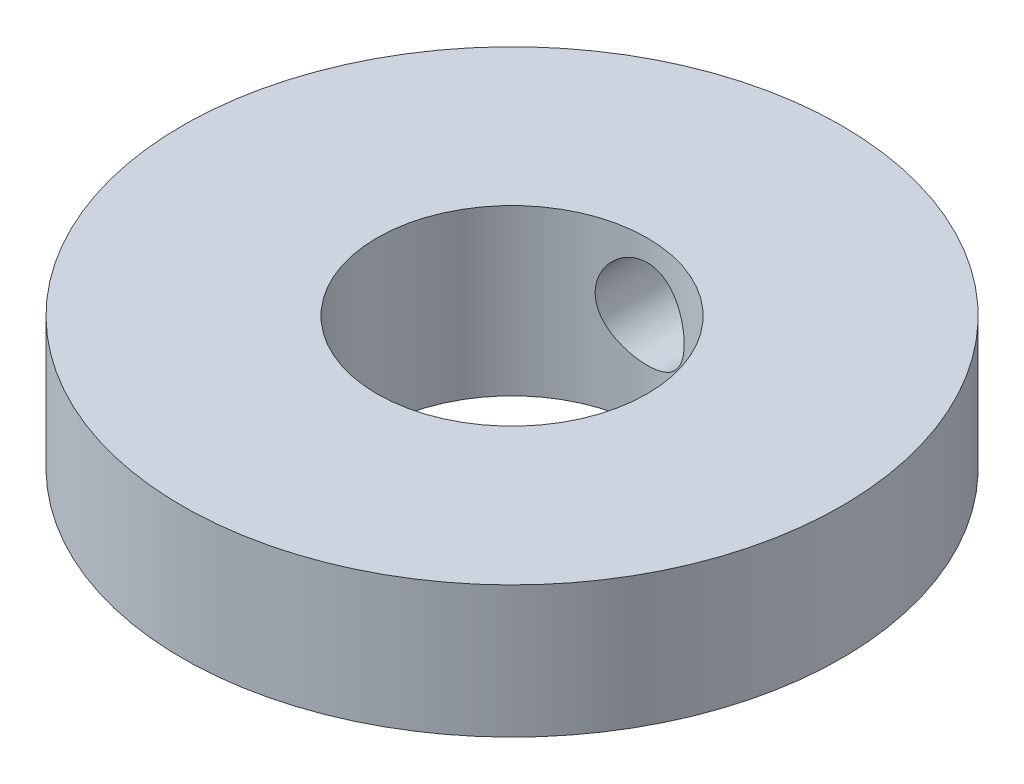
ISO-10303-21;
HEADER;
FILE_DESCRIPTION(('STEP AP214'),'2;1');
FILE_NAME('part.step','',(''),(''),'','','');
FILE_SCHEMA(('AUTOMOTIVE_DESIGN { 1 0 10303 214 1 1 1 1 }'));
ENDSEC;
DATA;
#1=APPLICATION_CONTEXT('core data for automotive mechanical design processes');
#2=APPLICATION_PROTOCOL_DEFINITION('international standard','automotive_design',2000,#1);
#3=PRODUCT_CONTEXT('',#1,'mechanical');
#4=PRODUCT('Part','Part','',(#3));
#5=PRODUCT_RELATED_PRODUCT_CATEGORY('part','',(#4));
#6=PRODUCT_DEFINITION_FORMATION('','',#4);
#7=PRODUCT_DEFINITION_CONTEXT('part definition',#1,'design');
#8=PRODUCT_DEFINITION('design','',#6,#7);
#9=PRODUCT_DEFINITION_SHAPE('','',#8);
#10=(LENGTH_UNIT() NAMED_UNIT(*) SI_UNIT(.MILLI.,.METRE.));
#11=(NAMED_UNIT(*) PLANE_ANGLE_UNIT() SI_UNIT($,.RADIAN.));
#12=(NAMED_UNIT(*) SI_UNIT($,.STERADIAN.) SOLID_ANGLE_UNIT());
#13=UNCERTAINTY_MEASURE_WITH_UNIT(LENGTH_MEASURE(1.E-05),#10,'distance_accuracy_value','');
#14=(GEOMETRIC_REPRESENTATION_CONTEXT(3) GLOBAL_UNCERTAINTY_ASSIGNED_CONTEXT((#13)) GLOBAL_UNIT_ASSIGNED_CONTEXT((#10,
#11,#12)) REPRESENTATION_CONTEXT('',''));
#15=CARTESIAN_POINT('',(0.,0.,0.));
#16=DIRECTION('',(0.,0.,1.));
#17=DIRECTION('',(1.,0.,0.));
#18=AXIS2_PLACEMENT_3D('',#15,#16,#17);
#19=CARTESIAN_POINT('',(0.,0.999999999999997,0.));
#20=DIRECTION('',(0.,1.,0.));
#21=DIRECTION('',(0.,0.,1.));
#22=AXIS2_PLACEMENT_3D('',#19,#20,#21);
#23=CONICAL_SURFACE('',#22,6.00000000000001,0.785398163397454);
#24=CARTESIAN_POINT('',(0.,0.,0.));
#25=DIRECTION('',(0.,-1.,0.));
#26=DIRECTION('',(0.,0.,-1.));
#27=AXIS2_PLACEMENT_3D('',#24,#25,#26);
#28=CIRCLE('',#27,5.);
#29=CARTESIAN_POINT('',(0.,0.,-5.));
#30=VERTEX_POINT('',#29);
#31=EDGE_CURVE('E10',#30,#30,#28,.T.);
#32=ORIENTED_EDGE('',*,*,#31,.F.);
#33=EDGE_LOOP('',(#32));
#34=FACE_BOUND('',#33,.T.);
#35=CARTESIAN_POINT('',(0.,0.999999999999997,0.));
#36=DIRECTION('',(0.,-1.,0.));
#37=DIRECTION('',(0.,0.,-1.));
#38=AXIS2_PLACEMENT_3D('',#35,#36,#37);
#39=CIRCLE('',#38,6.00000000000001);
#40=CARTESIAN_POINT('',(0.,0.999999999999997,-6.00000000000001));
#41=VERTEX_POINT('',#40);
#42=EDGE_CURVE('E56',#41,#41,#39,.T.);
#43=ORIENTED_EDGE('',*,*,#42,.T.);
#44=EDGE_LOOP('',(#43));
#45=FACE_BOUND('',#44,.T.);
#46=ADVANCED_FACE('F40',(#34,#45),#23,.T.);
#47=CARTESIAN_POINT('',(0.,0.,4.1));
#48=DIRECTION('',(0.,1.,0.));
#49=DIRECTION('',(0.,0.,1.));
#50=AXIS2_PLACEMENT_3D('',#47,#48,#49);
#51=PLANE('',#50);
#52=CARTESIAN_POINT('',(0.,0.,0.));
#53=DIRECTION('',(0.,-1.,0.));
#54=DIRECTION('',(0.,0.,-1.));
#55=AXIS2_PLACEMENT_3D('',#52,#53,#54);
#56=CIRCLE('',#55,4.1);
#57=CARTESIAN_POINT('',(0.,0.,-4.1));
#58=VERTEX_POINT('',#57);
#59=EDGE_CURVE('E43',#58,#58,#56,.T.);
#60=ORIENTED_EDGE('',*,*,#59,.F.);
#61=EDGE_LOOP('',(#60));
#62=FACE_BOUND('',#61,.T.);
#63=ORIENTED_EDGE('',*,*,#31,.T.);
#64=EDGE_LOOP('',(#63));
#65=FACE_BOUND('',#64,.T.);
#66=ADVANCED_FACE('F98',(#62,#65),#51,.F.);
#67=CARTESIAN_POINT('',(0.,0.,0.));
#68=DIRECTION('',(0.,-1.,0.));
#69=DIRECTION('',(0.,0.,-1.));
#70=AXIS2_PLACEMENT_3D('',#67,#68,#69);
#71=CYLINDRICAL_SURFACE('',#70,4.1);
#72=CARTESIAN_POINT('',(0.,4.35,-4.1));
#73=CARTESIAN_POINT('',(0.0737111630562041,4.35000016743494,-4.1000000806559));
#74=CARTESIAN_POINT('',(0.147421689789712,4.34394326858112,-4.09799377794591));
#75=CARTESIAN_POINT('',(0.292674687394408,4.31994771628066,-4.09018765508382));
#76=CARTESIAN_POINT('',(0.364216879700478,4.30200754290364,-4.08438734966094));
#77=CARTESIAN_POINT('',(0.503018076222002,4.25492490429227,-4.06962414947325));
#78=CARTESIAN_POINT('',(0.570283924158112,4.22580089164781,-4.06066646616013));
#79=CARTESIAN_POINT('',(0.698976522874712,4.15725972837715,-4.0405049256985));
#80=CARTESIAN_POINT('',(0.760402163106731,4.11784062539983,-4.02930064260065));
#81=CARTESIAN_POINT('',(0.877752566517194,4.02842450428151,-4.00540237206026));
#82=CARTESIAN_POINT('',(0.933451965224357,3.97814113492791,-3.9926733325298));
#83=CARTESIAN_POINT('',(1.03579874043779,3.86903283060785,-3.96735503806707));
#84=CARTESIAN_POINT('',(1.08244418761992,3.81020607977427,-3.9547658134659));
#85=CARTESIAN_POINT('',(1.16663245289822,3.68366758093371,-3.93076879244806));
#86=CARTESIAN_POINT('',(1.20388460109373,3.61575354279026,-3.91940382139912));
#87=CARTESIAN_POINT('',(1.2663428295984,3.47418977835968,-3.89967390201978));
#88=CARTESIAN_POINT('',(1.29155248436287,3.40054176159096,-3.89130806367042));
#89=CARTESIAN_POINT('',(1.32836881593469,3.25215954898706,-3.87889222638682));
#90=CARTESIAN_POINT('',(1.34039695226253,3.17754140700485,-3.87470891055934));
#91=CARTESIAN_POINT('',(1.35182619025594,3.02723787191663,-3.87073714172203));
#92=CARTESIAN_POINT('',(1.3512310823163,2.95155280599829,-3.87094736945798));
#93=CARTESIAN_POINT('',(1.33775843878737,2.80483636174256,-3.87562193416032));
#94=CARTESIAN_POINT('',(1.32542802015055,2.73374766358651,-3.87989676502709));
#95=CARTESIAN_POINT('',(1.28972621282626,2.59471057438907,-3.8919092251993));
#96=CARTESIAN_POINT('',(1.26635353215823,2.5267625518385,-3.89964725970525));
#97=CARTESIAN_POINT('',(1.20886694892202,2.39468058987967,-3.91785129349519));
#98=CARTESIAN_POINT('',(1.17458901815267,2.33062396592721,-3.92835850055104));
#99=CARTESIAN_POINT('',(1.09637883362628,2.20899765230501,-3.95089939690232));
#100=CARTESIAN_POINT('',(1.05244384591102,2.15142980663495,-3.96293351806563));
#101=CARTESIAN_POINT('',(0.953527640808479,2.04133702694316,-3.98792079124611));
#102=CARTESIAN_POINT('',(0.89809825118202,1.98921750396182,-4.00088955560005));
#103=CARTESIAN_POINT('',(0.779125839733224,1.8949093077556,-4.02574855435128));
#104=CARTESIAN_POINT('',(0.715582077868852,1.8527215413199,-4.03763869020675));
#105=CARTESIAN_POINT('',(0.581340580863989,1.77915851054339,-4.05915029711047));
#106=CARTESIAN_POINT('',(0.510580768202032,1.74788947878619,-4.06874920582552));
#107=CARTESIAN_POINT('',(0.364414117052925,1.69782315404957,-4.08443323778912));
#108=CARTESIAN_POINT('',(0.289008861478788,1.67902163823064,-4.09051955068909));
#109=CARTESIAN_POINT('',(0.139125718605279,1.65513675043563,-4.09829667697753));
#110=CARTESIAN_POINT('',(0.064744147068853,1.64950536209984,-4.10016297146787));
#111=CARTESIAN_POINT('',(-0.0839144570552006,1.65056269433756,-4.09981461997456));
#112=CARTESIAN_POINT('',(-0.158191504802405,1.65724939214245,-4.09760064401729));
#113=CARTESIAN_POINT('',(-0.302355148665888,1.68231812976469,-4.08945625416194));
#114=CARTESIAN_POINT('',(-0.372306473620005,1.7003658524118,-4.08363214704165));
#115=CARTESIAN_POINT('',(-0.508161972733057,1.7472283578482,-4.06896101812048));
#116=CARTESIAN_POINT('',(-0.574065632136157,1.7760445068084,-4.06011361277137));
#117=CARTESIAN_POINT('',(-0.701860168063316,1.84445620951587,-4.04001084797669));
#118=CARTESIAN_POINT('',(-0.763602569042601,1.88431203915992,-4.0286989693893));
#119=CARTESIAN_POINT('',(-0.879702345338805,1.97336469853043,-4.00495206623292));
#120=CARTESIAN_POINT('',(-0.934057505801985,2.02256431917328,-3.9925167066724));
#121=CARTESIAN_POINT('',(-1.03634314156696,2.13148562046853,-3.967227435213));
#122=CARTESIAN_POINT('',(-1.08388261454486,2.19157671957381,-3.95437936853783));
#123=CARTESIAN_POINT('',(-1.16824867062623,2.31916014909289,-3.93028325422109));
#124=CARTESIAN_POINT('',(-1.20507522312565,2.38665250064941,-3.91903521115042));
#125=CARTESIAN_POINT('',(-1.26678599134302,2.52711447444346,-3.89952617255393));
#126=CARTESIAN_POINT('',(-1.29169935591977,2.60007021733449,-3.89125789856264));
#127=CARTESIAN_POINT('',(-1.32877939682772,2.74947524062709,-3.87875439870743));
#128=CARTESIAN_POINT('',(-1.34095163247806,2.82592298216094,-3.87451741395018));
#129=CARTESIAN_POINT('',(-1.3517769383077,2.9760174366298,-3.87075295729396));
#130=CARTESIAN_POINT('',(-1.35107744463095,3.04961232825154,-3.87099993733485));
#131=CARTESIAN_POINT('',(-1.33776647482694,3.19557816274012,-3.87561986596802));
#132=CARTESIAN_POINT('',(-1.32515567533759,3.26794917489341,-3.87999258019236));
#133=CARTESIAN_POINT('',(-1.28883356824607,3.40811433242203,-3.89220534438605));
#134=CARTESIAN_POINT('',(-1.26532703319376,3.47596756248779,-3.89998129026874));
#135=CARTESIAN_POINT('',(-1.20804560553727,3.60681948544705,-3.91810209323379));
#136=CARTESIAN_POINT('',(-1.17426846927378,3.66981711383935,-3.92844751153849));
#137=CARTESIAN_POINT('',(-1.09571872469852,3.79208828251116,-3.95109312600493));
#138=CARTESIAN_POINT('',(-1.05053774557258,3.85108743623715,-3.96345798785758));
#139=CARTESIAN_POINT('',(-0.951158804063214,3.96087584276375,-3.98847328203764));
#140=CARTESIAN_POINT('',(-0.89695832052929,4.01166279222396,-4.00112379335344));
#141=CARTESIAN_POINT('',(-0.778625685054189,4.10551123714932,-4.02585713200477));
#142=CARTESIAN_POINT('',(-0.714196276469474,4.1482095621681,-4.03790061212615));
#143=CARTESIAN_POINT('',(-0.578681711796834,4.22212090208891,-4.05953518658945));
#144=CARTESIAN_POINT('',(-0.50759845212688,4.25333717706896,-4.06912697679897));
#145=CARTESIAN_POINT('',(-0.364649265000013,4.30189286666039,-4.08435075447741));
#146=CARTESIAN_POINT('',(-0.293021680152443,4.31987648198325,-4.09016466927805));
#147=CARTESIAN_POINT('',(-0.147595470965586,4.34392841473737,-4.09798875682538));
#148=CARTESIAN_POINT('',(-0.0737974165764129,4.34999983236913,-4.09999991924972));
#149=CARTESIAN_POINT('',(0.,4.35,-4.1));
#150=B_SPLINE_CURVE_WITH_KNOTS('',3,(#72,#73,#74,#75,#76,#77,#78,#79,#80,#81,#82,#83,#84,#85,
#86,#87,#88,#89,#90,#91,#92,#93,#94,#95,#96,#97,#98,#99,#100,#101,#102,#103,#104,#105,#106,#107,
#108,#109,#110,#111,#112,#113,#114,#115,#116,#117,#118,#119,#120,#121,#122,#123,#124,#125,#126,
#127,#128,#129,#130,#131,#132,#133,#134,#135,#136,#137,#138,#139,#140,#141,#142,#143,#144,#145,
#146,#147,#148,#149),.UNSPECIFIED.,.T.,.F.,(4,2,2,2,2,2,2,2,2,2,2,2,2,2,2,2,2,2,2,2,2,2,2,2,2,2,
2,2,2,2,2,2,2,2,2,2,2,2,4),(0.,0.220861982205062,0.441752219220953,0.662279557197952,
0.882848746173892,1.11015594188099,1.33751152187185,1.57121803763517,1.80485514141413,
2.03078193580496,2.25664089188068,2.47246065121859,2.68830566842612,2.90756430947025,
3.12688510379957,3.35736086620194,3.58785766334677,3.82053835200392,4.05314018968711,
4.27587649246112,4.49857622268353,4.71501074468831,4.93147273467955,5.1535508689878,
5.37569544090047,5.607675429976,5.83965608175226,6.07106618795475,6.30237528116303,
6.52208303010694,6.74177829900433,6.95750236971497,7.17327360022313,7.39827022749897,
7.62332985226365,7.85686911826721,8.09034202460456,8.31152001982588,8.53264044488621),.UNSPECIFIED.);
#151=CARTESIAN_POINT('',(0.,4.35,-4.1));
#152=VERTEX_POINT('',#151);
#153=EDGE_CURVE('E68',#152,#152,#150,.T.);
#154=ORIENTED_EDGE('',*,*,#153,.T.);
#155=EDGE_LOOP('',(#154));
#156=FACE_BOUND('',#155,.T.);
#157=CARTESIAN_POINT('',(0.,5.,0.));
#158=DIRECTION('',(0.,-1.,0.));
#159=DIRECTION('',(0.,0.,-1.));
#160=AXIS2_PLACEMENT_3D('',#157,#158,#159);
#161=CIRCLE('',#160,4.1);
#162=CARTESIAN_POINT('',(0.,5.,-4.1));
#163=VERTEX_POINT('',#162);
#164=EDGE_CURVE('E50',#163,#163,#161,.T.);
#165=ORIENTED_EDGE('',*,*,#164,.F.);
#166=EDGE_LOOP('',(#165));
#167=FACE_BOUND('',#166,.T.);
#168=ORIENTED_EDGE('',*,*,#59,.T.);
#169=EDGE_LOOP('',(#168));
#170=FACE_BOUND('',#169,.T.);
#171=ADVANCED_FACE('F103',(#156,#167,#170),#71,.F.);
#172=CARTESIAN_POINT('',(0.,5.,10.));
#173=DIRECTION('',(0.,-1.,0.));
#174=DIRECTION('',(0.,0.,-1.));
#175=AXIS2_PLACEMENT_3D('',#172,#173,#174);
#176=PLANE('',#175);
#177=CARTESIAN_POINT('',(0.,5.,0.));
#178=DIRECTION('',(0.,-1.,0.));
#179=DIRECTION('',(0.,0.,-1.));
#180=AXIS2_PLACEMENT_3D('',#177,#178,#179);
#181=CIRCLE('',#180,10.);
#182=CARTESIAN_POINT('',(0.,5.,-10.));
#183=VERTEX_POINT('',#182);
#184=EDGE_CURVE('E51',#183,#183,#181,.T.);
#185=ORIENTED_EDGE('',*,*,#184,.F.);
#186=EDGE_LOOP('',(#185));
#187=FACE_BOUND('',#186,.T.);
#188=ORIENTED_EDGE('',*,*,#164,.T.);
#189=EDGE_LOOP('',(#188));
#190=FACE_BOUND('',#189,.T.);
#191=ADVANCED_FACE('F91',(#187,#190),#176,.F.);
#192=CARTESIAN_POINT('',(0.,0.,0.));
#193=DIRECTION('',(0.,-1.,0.));
#194=DIRECTION('',(0.,0.,-1.));
#195=AXIS2_PLACEMENT_3D('',#192,#193,#194);
#196=CYLINDRICAL_SURFACE('',#195,10.);
#197=CARTESIAN_POINT('',(0.,4.35,-10.));
#198=CARTESIAN_POINT('',(-0.0754619928033733,4.34999682722801,-9.99999888063832));
#199=CARTESIAN_POINT('',(-0.150969869142969,4.34365141957742,-9.99913682811448));
#200=CARTESIAN_POINT('',(-0.29988092356667,4.31844053604537,-9.99578086597856));
#201=CARTESIAN_POINT('',(-0.373281880743254,4.29956232090011,-9.99328529597587));
#202=CARTESIAN_POINT('',(-0.515802030248598,4.2498552213408,-9.98694317619014));
#203=CARTESIAN_POINT('',(-0.584924199822182,4.21903475743612,-9.98309757849418));
#204=CARTESIAN_POINT('',(-0.717003214570631,4.14633730788185,-9.9744820594727));
#205=CARTESIAN_POINT('',(-0.779961038453511,4.10446208130267,-9.96971228523732));
#206=CARTESIAN_POINT('',(-0.898338108312008,4.01055852245592,-9.95974611568941));
#207=CARTESIAN_POINT('',(-0.95371233315915,3.95847367129148,-9.95454744334816));
#208=CARTESIAN_POINT('',(-1.05496231993912,3.84575085410387,-9.9443275535923));
#209=CARTESIAN_POINT('',(-1.10083757514474,3.7851124320762,-9.93930634565644));
#210=CARTESIAN_POINT('',(-1.18195809747663,3.65670725245793,-9.92998765268688));
#211=CARTESIAN_POINT('',(-1.21716063931035,3.58891327130734,-9.92569310616535));
#212=CARTESIAN_POINT('',(-1.27566354643984,3.44830781360978,-9.91834447659887));
#213=CARTESIAN_POINT('',(-1.29896443705713,3.37549655867897,-9.9152903388053));
#214=CARTESIAN_POINT('',(-1.33286460358717,3.22739324580081,-9.9107903599778));
#215=CARTESIAN_POINT('',(-1.34354033567971,3.15211898757034,-9.90933484179661));
#216=CARTESIAN_POINT('',(-1.3521238264948,3.00083435438565,-9.90816739077428));
#217=CARTESIAN_POINT('',(-1.35003218142711,2.92482401397045,-9.90845537651516));
#218=CARTESIAN_POINT('',(-1.33320294565254,2.77476043741509,-9.91073353943524));
#219=CARTESIAN_POINT('',(-1.31854992526651,2.70069751942842,-9.91271233284641));
#220=CARTESIAN_POINT('',(-1.27714599976141,2.55609143059138,-9.9181313878244));
#221=CARTESIAN_POINT('',(-1.25039481245862,2.48554834188189,-9.92157168347992));
#222=CARTESIAN_POINT('',(-1.18546414002734,2.34972369702956,-9.92953889350849));
#223=CARTESIAN_POINT('',(-1.14724825716348,2.28445975147488,-9.9340692593953));
#224=CARTESIAN_POINT('',(-1.06049899452053,2.16123909599715,-9.94370355539348));
#225=CARTESIAN_POINT('',(-1.01196506487275,2.10328277577395,-9.94880751606598));
#226=CARTESIAN_POINT('',(-0.905490408568417,1.99583193792903,-9.95906440897064));
#227=CARTESIAN_POINT('',(-0.847476855238479,1.94640956274364,-9.96421740371901));
#228=CARTESIAN_POINT('',(-0.723939528141935,1.85799244353248,-9.97395328850661));
#229=CARTESIAN_POINT('',(-0.658415731781289,1.81899773087878,-9.97853617683064));
#230=CARTESIAN_POINT('',(-0.521659654039003,1.75254142231655,-9.98661902116));
#231=CARTESIAN_POINT('',(-0.450424955814264,1.7250847402891,-9.99011851559678));
#232=CARTESIAN_POINT('',(-0.304298284152512,1.68254321250507,-9.99563623203195));
#233=CARTESIAN_POINT('',(-0.229406510867798,1.66745769047524,-9.99765453499948));
#234=CARTESIAN_POINT('',(-0.0787149346730223,1.650181125501,-9.99997186248422));
#235=CARTESIAN_POINT('',(-0.00292671255106537,1.64789077898818,-10.0002841271737));
#236=CARTESIAN_POINT('',(0.147952556499445,1.65600694094178,-9.99919005352924));
#237=CARTESIAN_POINT('',(0.22304362076266,1.66641313285529,-9.99778375804286));
#238=CARTESIAN_POINT('',(0.370101053494709,1.69954444597174,-9.99341879328227));
#239=CARTESIAN_POINT('',(0.442078371506373,1.72222182673868,-9.99046614145111));
#240=CARTESIAN_POINT('',(0.581208755482311,1.77920188749689,-9.98333879043991));
#241=CARTESIAN_POINT('',(0.648361633112986,1.81350502102876,-9.97916404358472));
#242=CARTESIAN_POINT('',(0.776377832753261,1.89300034067376,-9.97002435262575));
#243=CARTESIAN_POINT('',(0.837201225473105,1.9382562929996,-9.9650548411669));
#244=CARTESIAN_POINT('',(0.950424716120297,2.03828293570065,-9.95489479471861));
#245=CARTESIAN_POINT('',(1.00282442138043,2.09305406937521,-9.94970424944));
#246=CARTESIAN_POINT('',(1.09806885763805,2.21099555455155,-9.93964585603091));
#247=CARTESIAN_POINT('',(1.14084747545805,2.27421952973939,-9.93478039313452));
#248=CARTESIAN_POINT('',(1.21517761423776,2.40701370667307,-9.92596344446456));
#249=CARTESIAN_POINT('',(1.24672939110457,2.47658376371948,-9.9220119378588));
#250=CARTESIAN_POINT('',(1.29760489107688,2.61988808833908,-9.91548697301));
#251=CARTESIAN_POINT('',(1.31696494568639,2.69360926328963,-9.91290942391312));
#252=CARTESIAN_POINT('',(1.34302395800419,2.84329351978994,-9.90941281755323));
#253=CARTESIAN_POINT('',(1.34972361139683,2.91925647792156,-9.90849366916185));
#254=CARTESIAN_POINT('',(1.35025744062788,3.07060983121532,-9.90842088198776));
#255=CARTESIAN_POINT('',(1.34419550785697,3.14599987398083,-9.90925298633456));
#256=CARTESIAN_POINT('',(1.31959923933092,3.29467863111727,-9.9125581709462));
#257=CARTESIAN_POINT('',(1.30106490957631,3.36796734649913,-9.91503125042156));
#258=CARTESIAN_POINT('',(1.25208409948606,3.51034361122076,-9.9213351038829));
#259=CARTESIAN_POINT('',(1.22164348798662,3.57943321102978,-9.92516520887735));
#260=CARTESIAN_POINT('',(1.14972442541764,3.71154092476795,-9.93375254177548));
#261=CARTESIAN_POINT('',(1.10824574580314,3.77455891294662,-9.93850978887523));
#262=CARTESIAN_POINT('',(1.01504542221475,3.89326450697356,-9.94846169128068));
#263=CARTESIAN_POINT('',(0.963246499079041,3.94889118186504,-9.95365946544204));
#264=CARTESIAN_POINT('',(0.851038566680568,4.05070120163871,-9.96387978259459));
#265=CARTESIAN_POINT('',(0.790627542416162,4.09688233034126,-9.9689022842334));
#266=CARTESIAN_POINT('',(0.662599690813558,4.17866831448148,-9.97823111031075));
#267=CARTESIAN_POINT('',(0.594952131612162,4.2142254177838,-9.98253416400673));
#268=CARTESIAN_POINT('',(0.454623107862652,4.27342243437015,-9.98990664479829));
#269=CARTESIAN_POINT('',(0.381947111499173,4.29707506852724,-9.99297738800135));
#270=CARTESIAN_POINT('',(0.257427740790176,4.32624121207728,-9.99681378831678));
#271=CARTESIAN_POINT('',(0.206363707072771,4.33513765015697,-9.99800267851091));
#272=CARTESIAN_POINT('',(0.103540312770608,4.34701810566447,-9.99959616481477));
#273=CARTESIAN_POINT('',(0.0517809585431024,4.35000217711153,-10.0000007680903));
#274=CARTESIAN_POINT('',(0.,4.35,-10.));
#275=B_SPLINE_CURVE_WITH_KNOTS('',3,(#197,#198,#199,#200,#201,#202,#203,#204,#205,#206,#207,
#208,#209,#210,#211,#212,#213,#214,#215,#216,#217,#218,#219,#220,#221,#222,#223,#224,#225,#226,
#227,#228,#229,#230,#231,#232,#233,#234,#235,#236,#237,#238,#239,#240,#241,#242,#243,#244,#245,
#246,#247,#248,#249,#250,#251,#252,#253,#254,#255,#256,#257,#258,#259,#260,#261,#262,#263,#264,
#265,#266,#267,#268,#269,#270,#271,#272,#273,#274),.UNSPECIFIED.,.T.,.F.,(4,2,2,2,2,2,2,2,2,2,2,
2,2,2,2,2,2,2,2,2,2,2,2,2,2,2,2,2,2,2,2,2,2,2,2,2,2,2,4),(0.,0.226196811709442,
0.452623899192088,0.67889162204794,0.905123362114558,1.13264478023607,1.3601783324746,
1.58861107839265,1.81703374075091,2.04406590633333,2.27108747007041,2.49659249268716,
2.72210277536779,2.94833671659616,3.17458271729316,3.40265648023177,3.63073092933233,
3.85890241385547,4.08706142448283,4.31344720305692,4.53982733744594,4.76533301790314,
4.9908474967373,5.21770789165438,5.44457885852407,5.67296416747485,5.90134427022681,
6.12904053575397,6.35672428909187,6.58256165180531,6.80839890586772,7.03412498039197,
7.25985572897407,7.48734500396143,7.71488759298808,7.94343804954775,8.17174376045444,
8.326958250701,8.48217132279979),.UNSPECIFIED.);
#276=CARTESIAN_POINT('',(0.,4.35,-10.));
#277=VERTEX_POINT('',#276);
#278=EDGE_CURVE('E64',#277,#277,#275,.T.);
#279=ORIENTED_EDGE('',*,*,#278,.T.);
#280=EDGE_LOOP('',(#279));
#281=FACE_BOUND('',#280,.T.);
#282=CARTESIAN_POINT('',(0.,0.999999999999996,0.));
#283=DIRECTION('',(0.,-1.,0.));
#284=DIRECTION('',(0.,0.,-1.));
#285=AXIS2_PLACEMENT_3D('',#282,#283,#284);
#286=CIRCLE('',#285,10.);
#287=CARTESIAN_POINT('',(0.,0.999999999999996,-10.));
#288=VERTEX_POINT('',#287);
#289=EDGE_CURVE('E57',#288,#288,#286,.T.);
#290=ORIENTED_EDGE('',*,*,#289,.F.);
#291=EDGE_LOOP('',(#290));
#292=FACE_BOUND('',#291,.T.);
#293=ORIENTED_EDGE('',*,*,#184,.T.);
#294=EDGE_LOOP('',(#293));
#295=FACE_BOUND('',#294,.T.);
#296=ADVANCED_FACE('F73',(#281,#292,#295),#196,.T.);
#297=CARTESIAN_POINT('',(0.,0.999999999999996,6.00000000000001));
#298=DIRECTION('',(0.,1.,0.));
#299=DIRECTION('',(0.,0.,1.));
#300=AXIS2_PLACEMENT_3D('',#297,#298,#299);
#301=PLANE('',#300);
#302=ORIENTED_EDGE('',*,*,#42,.F.);
#303=EDGE_LOOP('',(#302));
#304=FACE_BOUND('',#303,.T.);
#305=ORIENTED_EDGE('',*,*,#289,.T.);
#306=EDGE_LOOP('',(#305));
#307=FACE_BOUND('',#306,.T.);
#308=ADVANCED_FACE('F85',(#304,#307),#301,.F.);
#309=CARTESIAN_POINT('',(0.,3.,-10.));
#310=DIRECTION('',(0.,0.,-1.));
#311=DIRECTION('',(-1.,0.,0.));
#312=AXIS2_PLACEMENT_3D('',#309,#310,#311);
#313=CYLINDRICAL_SURFACE('',#312,1.35);
#314=ORIENTED_EDGE('',*,*,#153,.F.);
#315=EDGE_LOOP('',(#314));
#316=FACE_BOUND('',#315,.T.);
#317=ORIENTED_EDGE('',*,*,#278,.F.);
#318=EDGE_LOOP('',(#317));
#319=FACE_BOUND('',#318,.T.);
#320=ADVANCED_FACE('F80',(#316,#319),#313,.F.);
#321=CLOSED_SHELL('',(#46,#66,#171,#191,#296,#308,#320));
#322=MANIFOLD_SOLID_BREP('B2',#321);
#323=ADVANCED_BREP_SHAPE_REPRESENTATION('',(#18,#322),#14);
#324=SHAPE_DEFINITION_REPRESENTATION(#9,#323);
ENDSEC;
END-ISO-10303-21;
